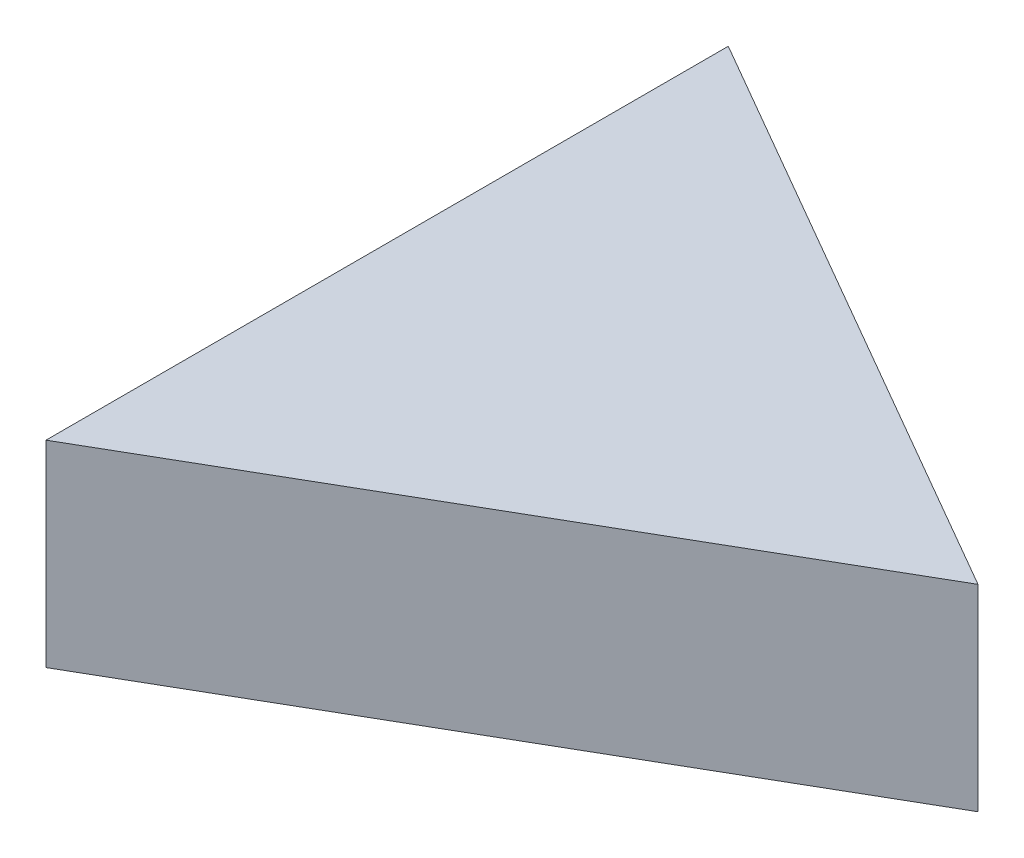
ISO-10303-21;
HEADER;
FILE_DESCRIPTION(('STEP AP214'),'2;1');
FILE_NAME('part.step','',(''),(''),'','','');
FILE_SCHEMA(('AUTOMOTIVE_DESIGN { 1 0 10303 214 1 1 1 1 }'));
ENDSEC;
DATA;
#1=APPLICATION_CONTEXT('core data for automotive mechanical design processes');
#2=APPLICATION_PROTOCOL_DEFINITION('international standard','automotive_design',2000,#1);
#3=PRODUCT_CONTEXT('',#1,'mechanical');
#4=PRODUCT('Part','Part','',(#3));
#5=PRODUCT_RELATED_PRODUCT_CATEGORY('part','',(#4));
#6=PRODUCT_DEFINITION_FORMATION('','',#4);
#7=PRODUCT_DEFINITION_CONTEXT('part definition',#1,'design');
#8=PRODUCT_DEFINITION('design','',#6,#7);
#9=PRODUCT_DEFINITION_SHAPE('','',#8);
#10=(LENGTH_UNIT() NAMED_UNIT(*) SI_UNIT(.MILLI.,.METRE.));
#11=(NAMED_UNIT(*) PLANE_ANGLE_UNIT() SI_UNIT($,.RADIAN.));
#12=(NAMED_UNIT(*) SI_UNIT($,.STERADIAN.) SOLID_ANGLE_UNIT());
#13=UNCERTAINTY_MEASURE_WITH_UNIT(LENGTH_MEASURE(1.E-05),#10,'distance_accuracy_value','');
#14=(GEOMETRIC_REPRESENTATION_CONTEXT(3) GLOBAL_UNCERTAINTY_ASSIGNED_CONTEXT((#13)) GLOBAL_UNIT_ASSIGNED_CONTEXT((#10,
#11,#12)) REPRESENTATION_CONTEXT('',''));
#15=CARTESIAN_POINT('',(0.,0.,0.));
#16=DIRECTION('',(0.,0.,1.));
#17=DIRECTION('',(1.,0.,0.));
#18=AXIS2_PLACEMENT_3D('',#15,#16,#17);
#19=CARTESIAN_POINT('',(-20.0000000000005,20.,34.6410161513783));
#20=DIRECTION('',(-0.5,0.,-0.866025403784439));
#21=DIRECTION('',(-0.866025403784439,0.,0.5));
#22=AXIS2_PLACEMENT_3D('',#19,#20,#21);
#23=PLANE('',#22);
#24=DIRECTION('',(0.866025403784439,0.,-0.5));
#25=VECTOR('',#24,1.);
#26=CARTESIAN_POINT('',(-20.0000000000005,0.,34.6410161513783));
#27=LINE('',#26,#25);
#28=CARTESIAN_POINT('',(-20.0000000000005,0.,34.6410161513783));
#29=VERTEX_POINT('',#28);
#30=CARTESIAN_POINT('',(40.0000000000009,0.,0.));
#31=VERTEX_POINT('',#30);
#32=EDGE_CURVE('E80',#29,#31,#27,.T.);
#33=ORIENTED_EDGE('',*,*,#32,.T.);
#34=DIRECTION('',(0.,-1.,0.));
#35=VECTOR('',#34,1.);
#36=CARTESIAN_POINT('',(40.0000000000009,20.,0.));
#37=LINE('',#36,#35);
#38=CARTESIAN_POINT('',(40.0000000000009,20.,0.));
#39=VERTEX_POINT('',#38);
#40=EDGE_CURVE('E11',#39,#31,#37,.T.);
#41=ORIENTED_EDGE('',*,*,#40,.F.);
#42=DIRECTION('',(0.866025403784439,0.,-0.5));
#43=VECTOR('',#42,1.);
#44=CARTESIAN_POINT('',(-20.0000000000005,20.,34.6410161513783));
#45=LINE('',#44,#43);
#46=CARTESIAN_POINT('',(-20.0000000000005,20.,34.6410161513783));
#47=VERTEX_POINT('',#46);
#48=EDGE_CURVE('E73',#47,#39,#45,.T.);
#49=ORIENTED_EDGE('',*,*,#48,.F.);
#50=DIRECTION('',(0.,-1.,0.));
#51=VECTOR('',#50,1.);
#52=CARTESIAN_POINT('',(-20.0000000000005,20.,34.6410161513783));
#53=LINE('',#52,#51);
#54=EDGE_CURVE('E81',#47,#29,#53,.T.);
#55=ORIENTED_EDGE('',*,*,#54,.T.);
#56=EDGE_LOOP('',(#33,#41,#49,#55));
#57=FACE_BOUND('',#56,.T.);
#58=ADVANCED_FACE('F33',(#57),#23,.F.);
#59=CARTESIAN_POINT('',(40.0000000000009,20.,0.));
#60=DIRECTION('',(-0.5,0.,0.866025403784439));
#61=DIRECTION('',(0.866025403784439,0.,0.5));
#62=AXIS2_PLACEMENT_3D('',#59,#60,#61);
#63=PLANE('',#62);
#64=DIRECTION('',(-0.866025403784439,0.,-0.5));
#65=VECTOR('',#64,1.);
#66=CARTESIAN_POINT('',(40.0000000000009,0.,0.));
#67=LINE('',#66,#65);
#68=CARTESIAN_POINT('',(-20.0000000000005,0.,-34.6410161513783));
#69=VERTEX_POINT('',#68);
#70=EDGE_CURVE('E61',#31,#69,#67,.T.);
#71=ORIENTED_EDGE('',*,*,#70,.T.);
#72=DIRECTION('',(0.,-1.,0.));
#73=VECTOR('',#72,1.);
#74=CARTESIAN_POINT('',(-20.0000000000005,20.,-34.6410161513783));
#75=LINE('',#74,#73);
#76=CARTESIAN_POINT('',(-20.0000000000005,20.,-34.6410161513783));
#77=VERTEX_POINT('',#76);
#78=EDGE_CURVE('E41',#77,#69,#75,.T.);
#79=ORIENTED_EDGE('',*,*,#78,.F.);
#80=DIRECTION('',(-0.866025403784439,0.,-0.5));
#81=VECTOR('',#80,1.);
#82=CARTESIAN_POINT('',(40.0000000000009,20.,0.));
#83=LINE('',#82,#81);
#84=EDGE_CURVE('E69',#39,#77,#83,.T.);
#85=ORIENTED_EDGE('',*,*,#84,.F.);
#86=ORIENTED_EDGE('',*,*,#40,.T.);
#87=EDGE_LOOP('',(#71,#79,#85,#86));
#88=FACE_BOUND('',#87,.T.);
#89=ADVANCED_FACE('F70',(#88),#63,.F.);
#90=CARTESIAN_POINT('',(-20.0000000000005,20.,-34.6410161513783));
#91=DIRECTION('',(1.,0.,0.));
#92=DIRECTION('',(0.,0.,-1.));
#93=AXIS2_PLACEMENT_3D('',#90,#91,#92);
#94=PLANE('',#93);
#95=DIRECTION('',(0.,0.,1.));
#96=VECTOR('',#95,1.);
#97=CARTESIAN_POINT('',(-20.0000000000005,0.,-34.6410161513783));
#98=LINE('',#97,#96);
#99=EDGE_CURVE('E66',#69,#29,#98,.T.);
#100=ORIENTED_EDGE('',*,*,#99,.T.);
#101=ORIENTED_EDGE('',*,*,#54,.F.);
#102=DIRECTION('',(0.,0.,1.));
#103=VECTOR('',#102,1.);
#104=CARTESIAN_POINT('',(-20.0000000000005,20.,-34.6410161513783));
#105=LINE('',#104,#103);
#106=EDGE_CURVE('E49',#77,#47,#105,.T.);
#107=ORIENTED_EDGE('',*,*,#106,.F.);
#108=ORIENTED_EDGE('',*,*,#78,.T.);
#109=EDGE_LOOP('',(#100,#101,#107,#108));
#110=FACE_BOUND('',#109,.T.);
#111=ADVANCED_FACE('F88',(#110),#94,.F.);
#112=CARTESIAN_POINT('',(0.,20.,0.));
#113=DIRECTION('',(0.,1.,0.));
#114=DIRECTION('',(0.,0.,1.));
#115=AXIS2_PLACEMENT_3D('',#112,#113,#114);
#116=PLANE('',#115);
#117=ORIENTED_EDGE('',*,*,#48,.T.);
#118=ORIENTED_EDGE('',*,*,#84,.T.);
#119=ORIENTED_EDGE('',*,*,#106,.T.);
#120=EDGE_LOOP('',(#117,#118,#119));
#121=FACE_BOUND('',#120,.T.);
#122=ADVANCED_FACE('F76',(#121),#116,.T.);
#123=CARTESIAN_POINT('',(0.,0.,0.));
#124=DIRECTION('',(0.,1.,0.));
#125=DIRECTION('',(0.,0.,1.));
#126=AXIS2_PLACEMENT_3D('',#123,#124,#125);
#127=PLANE('',#126);
#128=ORIENTED_EDGE('',*,*,#32,.F.);
#129=ORIENTED_EDGE('',*,*,#99,.F.);
#130=ORIENTED_EDGE('',*,*,#70,.F.);
#131=EDGE_LOOP('',(#128,#129,#130));
#132=FACE_BOUND('',#131,.T.);
#133=ADVANCED_FACE('F89',(#132),#127,.F.);
#134=CLOSED_SHELL('',(#58,#89,#111,#122,#133));
#135=MANIFOLD_SOLID_BREP('B2',#134);
#136=ADVANCED_BREP_SHAPE_REPRESENTATION('',(#18,#135),#14);
#137=SHAPE_DEFINITION_REPRESENTATION(#9,#136);
ENDSEC;
END-ISO-10303-21;
